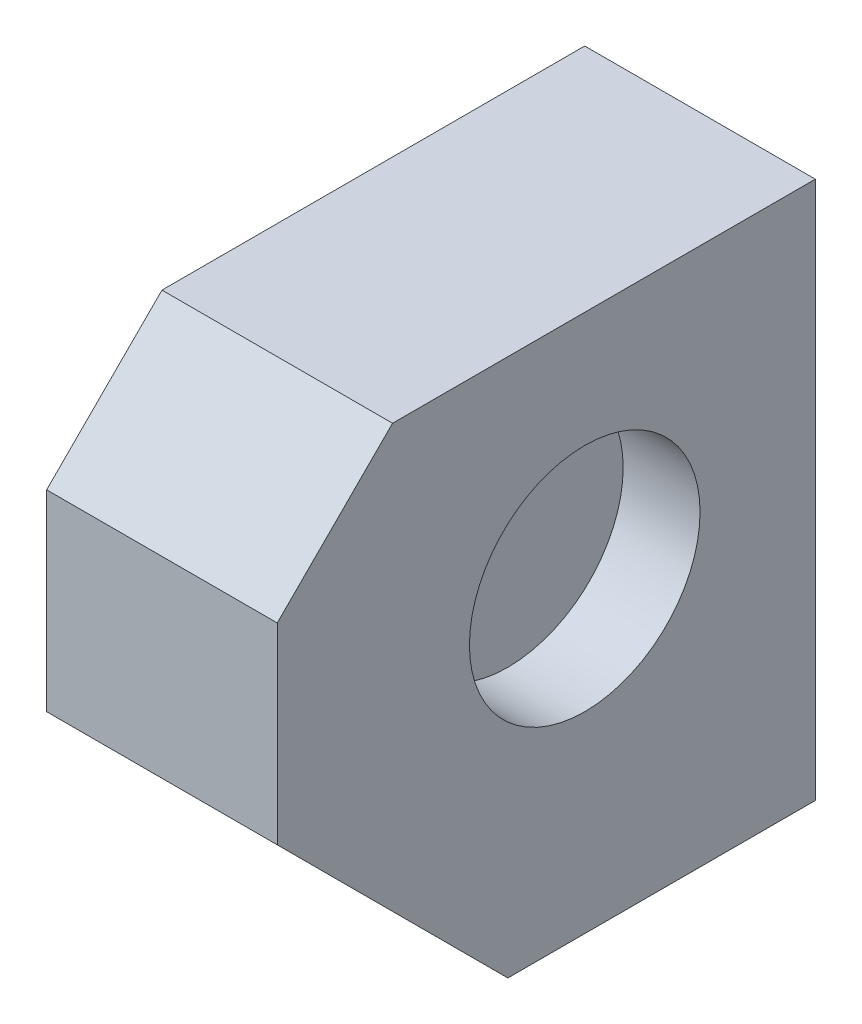
ISO-10303-21;
HEADER;
FILE_DESCRIPTION(('STEP AP214'),'2;1');
FILE_NAME('part.step','',(''),(''),'','','');
FILE_SCHEMA(('AUTOMOTIVE_DESIGN { 1 0 10303 214 1 1 1 1 }'));
ENDSEC;
DATA;
#1=APPLICATION_CONTEXT('core data for automotive mechanical design processes');
#2=APPLICATION_PROTOCOL_DEFINITION('international standard','automotive_design',2000,#1);
#3=PRODUCT_CONTEXT('',#1,'mechanical');
#4=PRODUCT('Part','Part','',(#3));
#5=PRODUCT_RELATED_PRODUCT_CATEGORY('part','',(#4));
#6=PRODUCT_DEFINITION_FORMATION('','',#4);
#7=PRODUCT_DEFINITION_CONTEXT('part definition',#1,'design');
#8=PRODUCT_DEFINITION('design','',#6,#7);
#9=PRODUCT_DEFINITION_SHAPE('','',#8);
#10=(LENGTH_UNIT() NAMED_UNIT(*) SI_UNIT(.MILLI.,.METRE.));
#11=(NAMED_UNIT(*) PLANE_ANGLE_UNIT() SI_UNIT($,.RADIAN.));
#12=(NAMED_UNIT(*) SI_UNIT($,.STERADIAN.) SOLID_ANGLE_UNIT());
#13=UNCERTAINTY_MEASURE_WITH_UNIT(LENGTH_MEASURE(1.E-05),#10,'distance_accuracy_value','');
#14=(GEOMETRIC_REPRESENTATION_CONTEXT(3) GLOBAL_UNCERTAINTY_ASSIGNED_CONTEXT((#13)) GLOBAL_UNIT_ASSIGNED_CONTEXT((#10,
#11,#12)) REPRESENTATION_CONTEXT('',''));
#15=CARTESIAN_POINT('',(0.,0.,0.));
#16=DIRECTION('',(0.,0.,1.));
#17=DIRECTION('',(1.,0.,0.));
#18=AXIS2_PLACEMENT_3D('',#15,#16,#17);
#19=CARTESIAN_POINT('',(-533.4,0.,0.));
#20=DIRECTION('',(1.,0.,0.));
#21=DIRECTION('',(0.,0.,-1.));
#22=AXIS2_PLACEMENT_3D('',#19,#20,#21);
#23=PLANE('',#22);
#24=CARTESIAN_POINT('',(-533.4,-450.85,1109.726));
#25=DIRECTION('',(1.,0.,0.));
#26=DIRECTION('',(0.,0.,-1.));
#27=AXIS2_PLACEMENT_3D('',#24,#25,#26);
#28=CIRCLE('',#27,19.05);
#29=CARTESIAN_POINT('',(-533.4,-450.85,1090.676));
#30=VERTEX_POINT('',#29);
#31=EDGE_CURVE('E19',#30,#30,#28,.T.);
#32=ORIENTED_EDGE('',*,*,#31,.T.);
#33=EDGE_LOOP('',(#32));
#34=FACE_BOUND('',#33,.T.);
#35=ADVANCED_FACE('F16',(#34),#23,.T.);
#36=CARTESIAN_POINT('',(-533.4,-450.85,1109.726));
#37=DIRECTION('',(1.,0.,0.));
#38=DIRECTION('',(0.,0.,-1.));
#39=AXIS2_PLACEMENT_3D('',#36,#37,#38);
#40=CYLINDRICAL_SURFACE('',#39,19.05);
#41=ORIENTED_EDGE('',*,*,#31,.F.);
#42=EDGE_LOOP('',(#41));
#43=FACE_BOUND('',#42,.T.);
#44=CARTESIAN_POINT('',(-520.7,-450.85,1109.726));
#45=DIRECTION('',(1.,0.,0.));
#46=DIRECTION('',(0.,0.,-1.));
#47=AXIS2_PLACEMENT_3D('',#44,#45,#46);
#48=CIRCLE('',#47,19.05);
#49=CARTESIAN_POINT('',(-520.7,-450.85,1090.676));
#50=VERTEX_POINT('',#49);
#51=EDGE_CURVE('E85',#50,#50,#48,.F.);
#52=ORIENTED_EDGE('',*,*,#51,.F.);
#53=EDGE_LOOP('',(#52));
#54=FACE_BOUND('',#53,.T.);
#55=ADVANCED_FACE('F102',(#43,#54),#40,.F.);
#56=CARTESIAN_POINT('',(-520.7,-501.65,1071.626));
#57=DIRECTION('',(1.,0.,0.));
#58=DIRECTION('',(0.,0.,-1.));
#59=AXIS2_PLACEMENT_3D('',#56,#57,#58);
#60=PLANE('',#59);
#61=ORIENTED_EDGE('',*,*,#51,.T.);
#62=EDGE_LOOP('',(#61));
#63=FACE_BOUND('',#62,.T.);
#64=DIRECTION('',(0.,0.,1.));
#65=VECTOR('',#64,1.);
#66=CARTESIAN_POINT('',(-520.7,-412.75,1071.626));
#67=LINE('',#66,#65);
#68=CARTESIAN_POINT('',(-520.7,-412.75,1141.476));
#69=VERTEX_POINT('',#68);
#70=CARTESIAN_POINT('',(-520.7,-412.75,1071.626));
#71=VERTEX_POINT('',#70);
#72=EDGE_CURVE('E72',#69,#71,#67,.F.);
#73=ORIENTED_EDGE('',*,*,#72,.F.);
#74=DIRECTION('',(0.,-0.707106781186548,0.707106781186548));
#75=VECTOR('',#74,1.);
#76=CARTESIAN_POINT('',(-520.7,-422.275,1151.001));
#77=LINE('',#76,#75);
#78=CARTESIAN_POINT('',(-520.7,-431.8,1160.526));
#79=VERTEX_POINT('',#78);
#80=EDGE_CURVE('E218',#79,#69,#77,.F.);
#81=ORIENTED_EDGE('',*,*,#80,.F.);
#82=DIRECTION('',(0.,1.,0.));
#83=VECTOR('',#82,1.);
#84=CARTESIAN_POINT('',(-520.7,0.,1160.526));
#85=LINE('',#84,#83);
#86=CARTESIAN_POINT('',(-520.7,-463.55,1160.526));
#87=VERTEX_POINT('',#86);
#88=EDGE_CURVE('E206',#87,#79,#85,.T.);
#89=ORIENTED_EDGE('',*,*,#88,.F.);
#90=DIRECTION('',(0.,-0.707106781186548,-0.707106781186548));
#91=VECTOR('',#90,1.);
#92=CARTESIAN_POINT('',(-520.7,-482.6,1141.476));
#93=LINE('',#92,#91);
#94=CARTESIAN_POINT('',(-520.7,-501.65,1122.426));
#95=VERTEX_POINT('',#94);
#96=EDGE_CURVE('E205',#95,#87,#93,.F.);
#97=ORIENTED_EDGE('',*,*,#96,.F.);
#98=DIRECTION('',(0.,0.,-1.));
#99=VECTOR('',#98,1.);
#100=CARTESIAN_POINT('',(-520.7,-501.65,1071.626));
#101=LINE('',#100,#99);
#102=CARTESIAN_POINT('',(-520.7,-501.65,1071.626));
#103=VERTEX_POINT('',#102);
#104=EDGE_CURVE('E75',#103,#95,#101,.F.);
#105=ORIENTED_EDGE('',*,*,#104,.F.);
#106=DIRECTION('',(0.,1.,0.));
#107=VECTOR('',#106,1.);
#108=CARTESIAN_POINT('',(-520.7,0.,1071.626));
#109=LINE('',#108,#107);
#110=EDGE_CURVE('E66',#103,#71,#109,.T.);
#111=ORIENTED_EDGE('',*,*,#110,.T.);
#112=EDGE_LOOP('',(#73,#81,#89,#97,#105,#111));
#113=FACE_BOUND('',#112,.T.);
#114=ADVANCED_FACE('F70',(#63,#113),#60,.T.);
#115=CARTESIAN_POINT('',(-520.7,-412.75,1071.626));
#116=DIRECTION('',(0.,1.,0.));
#117=DIRECTION('',(0.,0.,1.));
#118=AXIS2_PLACEMENT_3D('',#115,#116,#117);
#119=PLANE('',#118);
#120=DIRECTION('',(0.,0.,1.));
#121=VECTOR('',#120,1.);
#122=CARTESIAN_POINT('',(-558.8,-412.75,1071.626));
#123=LINE('',#122,#121);
#124=CARTESIAN_POINT('',(-558.8,-412.75,1141.476));
#125=VERTEX_POINT('',#124);
#126=CARTESIAN_POINT('',(-558.8,-412.75,1071.626));
#127=VERTEX_POINT('',#126);
#128=EDGE_CURVE('E221',#125,#127,#123,.F.);
#129=ORIENTED_EDGE('',*,*,#128,.F.);
#130=DIRECTION('',(1.,0.,0.));
#131=VECTOR('',#130,1.);
#132=CARTESIAN_POINT('',(-539.75,-412.75,1141.476));
#133=LINE('',#132,#131);
#134=EDGE_CURVE('E83',#69,#125,#133,.F.);
#135=ORIENTED_EDGE('',*,*,#134,.F.);
#136=ORIENTED_EDGE('',*,*,#72,.T.);
#137=DIRECTION('',(1.,0.,0.));
#138=VECTOR('',#137,1.);
#139=CARTESIAN_POINT('',(0.,-412.75,1071.626));
#140=LINE('',#139,#138);
#141=EDGE_CURVE('E77',#71,#127,#140,.F.);
#142=ORIENTED_EDGE('',*,*,#141,.T.);
#143=EDGE_LOOP('',(#129,#135,#136,#142));
#144=FACE_BOUND('',#143,.T.);
#145=ADVANCED_FACE('F80',(#144),#119,.T.);
#146=CARTESIAN_POINT('',(0.,0.,1071.626));
#147=DIRECTION('',(0.,0.,1.));
#148=DIRECTION('',(1.,0.,0.));
#149=AXIS2_PLACEMENT_3D('',#146,#147,#148);
#150=PLANE('',#149);
#151=ORIENTED_EDGE('',*,*,#141,.F.);
#152=ORIENTED_EDGE('',*,*,#110,.F.);
#153=DIRECTION('',(1.,0.,0.));
#154=VECTOR('',#153,1.);
#155=CARTESIAN_POINT('',(-558.8,-501.65,1071.626));
#156=LINE('',#155,#154);
#157=CARTESIAN_POINT('',(-558.8,-501.65,1071.626));
#158=VERTEX_POINT('',#157);
#159=EDGE_CURVE('E91',#158,#103,#156,.T.);
#160=ORIENTED_EDGE('',*,*,#159,.F.);
#161=DIRECTION('',(0.,1.,0.));
#162=VECTOR('',#161,1.);
#163=CARTESIAN_POINT('',(-558.8,-412.75,1071.626));
#164=LINE('',#163,#162);
#165=EDGE_CURVE('E89',#127,#158,#164,.F.);
#166=ORIENTED_EDGE('',*,*,#165,.F.);
#167=EDGE_LOOP('',(#151,#152,#160,#166));
#168=FACE_BOUND('',#167,.T.);
#169=ADVANCED_FACE('F87',(#168),#150,.F.);
#170=CARTESIAN_POINT('',(-558.8,-501.65,1071.626));
#171=DIRECTION('',(0.,-1.,0.));
#172=DIRECTION('',(0.,0.,-1.));
#173=AXIS2_PLACEMENT_3D('',#170,#171,#172);
#174=PLANE('',#173);
#175=ORIENTED_EDGE('',*,*,#104,.T.);
#176=DIRECTION('',(1.,0.,0.));
#177=VECTOR('',#176,1.);
#178=CARTESIAN_POINT('',(-539.75,-501.65,1122.426));
#179=LINE('',#178,#177);
#180=CARTESIAN_POINT('',(-558.8,-501.65,1122.426));
#181=VERTEX_POINT('',#180);
#182=EDGE_CURVE('E202',#181,#95,#179,.T.);
#183=ORIENTED_EDGE('',*,*,#182,.F.);
#184=DIRECTION('',(0.,0.,1.));
#185=VECTOR('',#184,1.);
#186=CARTESIAN_POINT('',(-558.8,-501.65,1071.626));
#187=LINE('',#186,#185);
#188=EDGE_CURVE('E224',#158,#181,#187,.T.);
#189=ORIENTED_EDGE('',*,*,#188,.F.);
#190=ORIENTED_EDGE('',*,*,#159,.T.);
#191=EDGE_LOOP('',(#175,#183,#189,#190));
#192=FACE_BOUND('',#191,.T.);
#193=ADVANCED_FACE('F129',(#192),#174,.T.);
#194=CARTESIAN_POINT('',(-539.75,-482.6,1141.476));
#195=DIRECTION('',(0.,-0.707106781186548,0.707106781186548));
#196=DIRECTION('',(0.,-0.707106781186548,-0.707106781186548));
#197=AXIS2_PLACEMENT_3D('',#194,#195,#196);
#198=PLANE('',#197);
#199=ORIENTED_EDGE('',*,*,#182,.T.);
#200=ORIENTED_EDGE('',*,*,#96,.T.);
#201=DIRECTION('',(1.,0.,0.));
#202=VECTOR('',#201,1.);
#203=CARTESIAN_POINT('',(0.,-463.55,1160.526));
#204=LINE('',#203,#202);
#205=CARTESIAN_POINT('',(-558.8,-463.55,1160.526));
#206=VERTEX_POINT('',#205);
#207=EDGE_CURVE('E208',#206,#87,#204,.T.);
#208=ORIENTED_EDGE('',*,*,#207,.F.);
#209=DIRECTION('',(0.,0.707106781186547,0.707106781186548));
#210=VECTOR('',#209,1.);
#211=CARTESIAN_POINT('',(-558.8,-501.65,1122.426));
#212=LINE('',#211,#210);
#213=EDGE_CURVE('E211',#181,#206,#212,.T.);
#214=ORIENTED_EDGE('',*,*,#213,.F.);
#215=EDGE_LOOP('',(#199,#200,#208,#214));
#216=FACE_BOUND('',#215,.T.);
#217=ADVANCED_FACE('F126',(#216),#198,.T.);
#218=CARTESIAN_POINT('',(0.,0.,1160.526));
#219=DIRECTION('',(0.,0.,1.));
#220=DIRECTION('',(1.,0.,0.));
#221=AXIS2_PLACEMENT_3D('',#218,#219,#220);
#222=PLANE('',#221);
#223=ORIENTED_EDGE('',*,*,#88,.T.);
#224=DIRECTION('',(1.,0.,0.));
#225=VECTOR('',#224,1.);
#226=CARTESIAN_POINT('',(-539.75,-431.8,1160.526));
#227=LINE('',#226,#225);
#228=CARTESIAN_POINT('',(-558.8,-431.8,1160.526));
#229=VERTEX_POINT('',#228);
#230=EDGE_CURVE('E34',#229,#79,#227,.T.);
#231=ORIENTED_EDGE('',*,*,#230,.F.);
#232=DIRECTION('',(0.,1.,0.));
#233=VECTOR('',#232,1.);
#234=CARTESIAN_POINT('',(-558.8,-412.75,1160.526));
#235=LINE('',#234,#233);
#236=EDGE_CURVE('E25',#206,#229,#235,.T.);
#237=ORIENTED_EDGE('',*,*,#236,.F.);
#238=ORIENTED_EDGE('',*,*,#207,.T.);
#239=EDGE_LOOP('',(#223,#231,#237,#238));
#240=FACE_BOUND('',#239,.T.);
#241=ADVANCED_FACE('F119',(#240),#222,.T.);
#242=CARTESIAN_POINT('',(-539.75,-422.275,1151.001));
#243=DIRECTION('',(0.,0.707106781186548,0.707106781186548));
#244=DIRECTION('',(0.,-0.707106781186548,0.707106781186548));
#245=AXIS2_PLACEMENT_3D('',#242,#243,#244);
#246=PLANE('',#245);
#247=ORIENTED_EDGE('',*,*,#134,.T.);
#248=DIRECTION('',(0.,0.707106781186546,-0.707106781186548));
#249=VECTOR('',#248,1.);
#250=CARTESIAN_POINT('',(-558.8,-431.8,1160.526));
#251=LINE('',#250,#249);
#252=EDGE_CURVE('E11',#229,#125,#251,.T.);
#253=ORIENTED_EDGE('',*,*,#252,.F.);
#254=ORIENTED_EDGE('',*,*,#230,.T.);
#255=ORIENTED_EDGE('',*,*,#80,.T.);
#256=EDGE_LOOP('',(#247,#253,#254,#255));
#257=FACE_BOUND('',#256,.T.);
#258=ADVANCED_FACE('F113',(#257),#246,.T.);
#259=CARTESIAN_POINT('',(-558.8,-412.75,1071.626));
#260=DIRECTION('',(-1.,0.,0.));
#261=DIRECTION('',(0.,0.,1.));
#262=AXIS2_PLACEMENT_3D('',#259,#260,#261);
#263=PLANE('',#262);
#264=ORIENTED_EDGE('',*,*,#236,.T.);
#265=ORIENTED_EDGE('',*,*,#252,.T.);
#266=ORIENTED_EDGE('',*,*,#128,.T.);
#267=ORIENTED_EDGE('',*,*,#165,.T.);
#268=ORIENTED_EDGE('',*,*,#188,.T.);
#269=ORIENTED_EDGE('',*,*,#213,.T.);
#270=EDGE_LOOP('',(#264,#265,#266,#267,#268,#269));
#271=FACE_BOUND('',#270,.T.);
#272=ADVANCED_FACE('F111',(#271),#263,.T.);
#273=CLOSED_SHELL('',(#35,#55,#114,#145,#169,#193,#217,#241,#258,#272));
#274=MANIFOLD_SOLID_BREP('B1',#273);
#275=ADVANCED_BREP_SHAPE_REPRESENTATION('',(#18,#274),#14);
#276=SHAPE_DEFINITION_REPRESENTATION(#9,#275);
ENDSEC;
END-ISO-10303-21;
